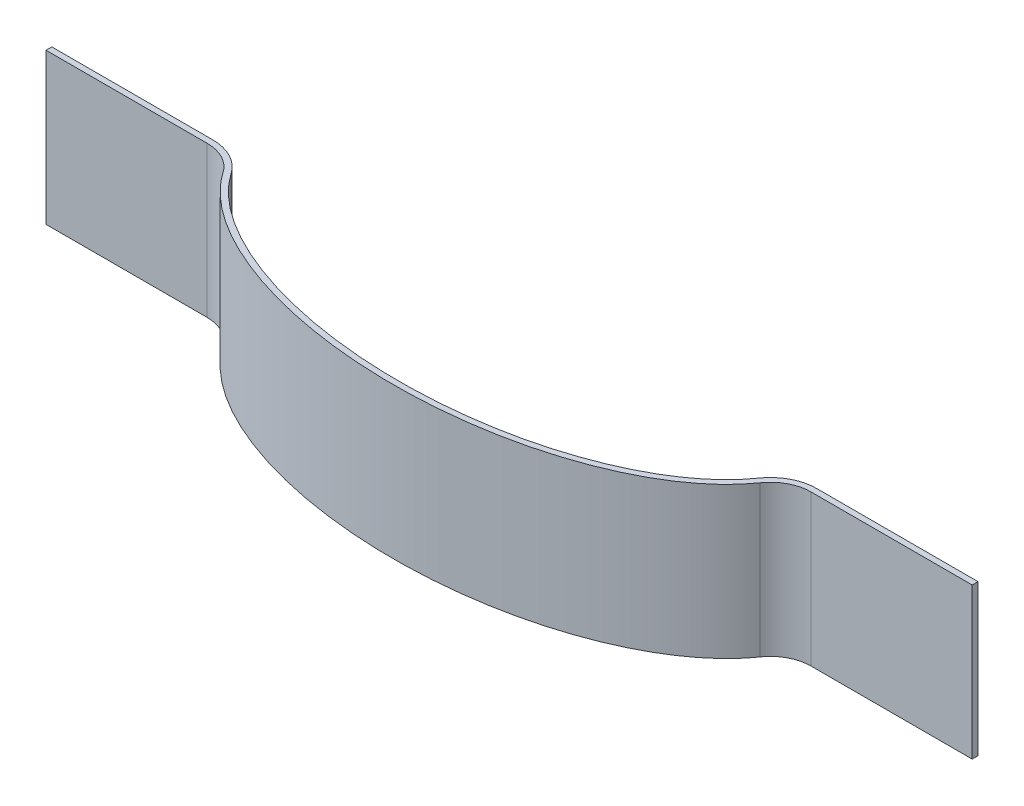
ISO-10303-21;
HEADER;
FILE_DESCRIPTION(('STEP AP214'),'2;1');
FILE_NAME('part.step','',(''),(''),'','','');
FILE_SCHEMA(('AUTOMOTIVE_DESIGN { 1 0 10303 214 1 1 1 1 }'));
ENDSEC;
DATA;
#1=APPLICATION_CONTEXT('core data for automotive mechanical design processes');
#2=APPLICATION_PROTOCOL_DEFINITION('international standard','automotive_design',2000,#1);
#3=PRODUCT_CONTEXT('',#1,'mechanical');
#4=PRODUCT('Part','Part','',(#3));
#5=PRODUCT_RELATED_PRODUCT_CATEGORY('part','',(#4));
#6=PRODUCT_DEFINITION_FORMATION('','',#4);
#7=PRODUCT_DEFINITION_CONTEXT('part definition',#1,'design');
#8=PRODUCT_DEFINITION('design','',#6,#7);
#9=PRODUCT_DEFINITION_SHAPE('','',#8);
#10=(LENGTH_UNIT() NAMED_UNIT(*) SI_UNIT(.MILLI.,.METRE.));
#11=(NAMED_UNIT(*) PLANE_ANGLE_UNIT() SI_UNIT($,.RADIAN.));
#12=(NAMED_UNIT(*) SI_UNIT($,.STERADIAN.) SOLID_ANGLE_UNIT());
#13=UNCERTAINTY_MEASURE_WITH_UNIT(LENGTH_MEASURE(1.E-05),#10,'distance_accuracy_value','');
#14=(GEOMETRIC_REPRESENTATION_CONTEXT(3) GLOBAL_UNCERTAINTY_ASSIGNED_CONTEXT((#13)) GLOBAL_UNIT_ASSIGNED_CONTEXT((#10,
#11,#12)) REPRESENTATION_CONTEXT('',''));
#15=CARTESIAN_POINT('',(0.,0.,0.));
#16=DIRECTION('',(0.,0.,1.));
#17=DIRECTION('',(1.,0.,0.));
#18=AXIS2_PLACEMENT_3D('',#15,#16,#17);
#19=CARTESIAN_POINT('',(82.8323720749977,15.9999999949704,4.99999999502958));
#20=DIRECTION('',(-1.,0.,0.));
#21=DIRECTION('',(0.,0.,1.));
#22=AXIS2_PLACEMENT_3D('',#19,#20,#21);
#23=PLANE('',#22);
#24=DIRECTION('',(0.,-1.,0.));
#25=VECTOR('',#24,1.);
#26=CARTESIAN_POINT('',(82.8323720749977,15.9999999949704,7.49999999502965));
#27=LINE('',#26,#25);
#28=CARTESIAN_POINT('',(82.8323720749977,15.9999999949704,7.49999999502965));
#29=VERTEX_POINT('',#28);
#30=CARTESIAN_POINT('',(82.8323720749977,3.,7.49999999502965));
#31=VERTEX_POINT('',#30);
#32=EDGE_CURVE('E405',#29,#31,#27,.T.);
#33=ORIENTED_EDGE('',*,*,#32,.T.);
#34=DIRECTION('',(0.,0.,-1.));
#35=VECTOR('',#34,1.);
#36=CARTESIAN_POINT('',(82.8323720749977,3.,4.99999999502958));
#37=LINE('',#36,#35);
#38=CARTESIAN_POINT('',(82.8323720749977,3.,6.99999999502962));
#39=VERTEX_POINT('',#38);
#40=EDGE_CURVE('E12',#31,#39,#37,.T.);
#41=ORIENTED_EDGE('',*,*,#40,.T.);
#42=DIRECTION('',(0.,-1.,0.));
#43=VECTOR('',#42,1.);
#44=CARTESIAN_POINT('',(82.8323720749977,15.9999999949704,6.99999999502962));
#45=LINE('',#44,#43);
#46=CARTESIAN_POINT('',(82.8323720749977,15.9999999949704,6.99999999502962));
#47=VERTEX_POINT('',#46);
#48=EDGE_CURVE('E322',#47,#39,#45,.T.);
#49=ORIENTED_EDGE('',*,*,#48,.F.);
#50=DIRECTION('',(0.,0.,-1.));
#51=VECTOR('',#50,1.);
#52=CARTESIAN_POINT('',(82.8323720749977,15.9999999949704,4.99999999502958));
#53=LINE('',#52,#51);
#54=EDGE_CURVE('E139',#29,#47,#53,.T.);
#55=ORIENTED_EDGE('',*,*,#54,.F.);
#56=EDGE_LOOP('',(#33,#41,#49,#55));
#57=FACE_BOUND('',#56,.T.);
#58=ADVANCED_FACE('F128',(#57),#23,.F.);
#59=CARTESIAN_POINT('',(3.,2.99999999999999,4.99999999502958));
#60=DIRECTION('',(1.,0.,0.));
#61=DIRECTION('',(0.,1.,0.));
#62=AXIS2_PLACEMENT_3D('',#59,#60,#61);
#63=PLANE('',#62);
#64=DIRECTION('',(0.,-1.,0.));
#65=VECTOR('',#64,1.);
#66=CARTESIAN_POINT('',(3.,15.9999999949704,7.49999999502963));
#67=LINE('',#66,#65);
#68=CARTESIAN_POINT('',(3.,15.9999999949704,7.49999999502963));
#69=VERTEX_POINT('',#68);
#70=CARTESIAN_POINT('',(3.,2.99999999999999,7.49999999502963));
#71=VERTEX_POINT('',#70);
#72=EDGE_CURVE('E400',#69,#71,#67,.T.);
#73=ORIENTED_EDGE('',*,*,#72,.F.);
#74=DIRECTION('',(0.,0.,-1.));
#75=VECTOR('',#74,1.);
#76=CARTESIAN_POINT('',(3.,15.9999999949704,4.99999999502958));
#77=LINE('',#76,#75);
#78=CARTESIAN_POINT('',(3.,15.9999999949704,6.99999999502963));
#79=VERTEX_POINT('',#78);
#80=EDGE_CURVE('E306',#69,#79,#77,.T.);
#81=ORIENTED_EDGE('',*,*,#80,.T.);
#82=DIRECTION('',(0.,-1.,0.));
#83=VECTOR('',#82,1.);
#84=CARTESIAN_POINT('',(3.,15.9999999949704,6.99999999502963));
#85=LINE('',#84,#83);
#86=CARTESIAN_POINT('',(3.,2.99999999999999,6.99999999502963));
#87=VERTEX_POINT('',#86);
#88=EDGE_CURVE('E327',#79,#87,#85,.T.);
#89=ORIENTED_EDGE('',*,*,#88,.T.);
#90=DIRECTION('',(0.,0.,-1.));
#91=VECTOR('',#90,1.);
#92=CARTESIAN_POINT('',(3.,2.99999999999999,4.99999999502958));
#93=LINE('',#92,#91);
#94=EDGE_CURVE('E304',#71,#87,#93,.T.);
#95=ORIENTED_EDGE('',*,*,#94,.F.);
#96=EDGE_LOOP('',(#73,#81,#89,#95));
#97=FACE_BOUND('',#96,.T.);
#98=ADVANCED_FACE('F263',(#97),#63,.F.);
#99=CARTESIAN_POINT('',(82.8323720749977,3.,4.99999999502958));
#100=DIRECTION('',(0.,1.,0.));
#101=DIRECTION('',(-1.,0.,0.));
#102=AXIS2_PLACEMENT_3D('',#99,#100,#101);
#103=PLANE('',#102);
#104=DIRECTION('',(-1.,0.,0.));
#105=VECTOR('',#104,1.);
#106=CARTESIAN_POINT('',(0.,2.99999999999999,7.49999999502965));
#107=LINE('',#106,#105);
#108=CARTESIAN_POINT('',(16.8897912138371,2.99999999999999,7.49999999502961));
#109=VERTEX_POINT('',#108);
#110=EDGE_CURVE('E412',#109,#71,#107,.T.);
#111=ORIENTED_EDGE('',*,*,#110,.T.);
#112=ORIENTED_EDGE('',*,*,#94,.T.);
#113=DIRECTION('',(-1.,0.,0.));
#114=VECTOR('',#113,1.);
#115=CARTESIAN_POINT('',(0.,2.99999999999999,6.99999999502965));
#116=LINE('',#115,#114);
#117=CARTESIAN_POINT('',(16.8897912138371,2.99999999999999,6.99999999502961));
#118=VERTEX_POINT('',#117);
#119=EDGE_CURVE('E289',#118,#87,#116,.T.);
#120=ORIENTED_EDGE('',*,*,#119,.F.);
#121=CARTESIAN_POINT('',(16.8897912138371,2.99999999999999,10.9999999950296));
#122=DIRECTION('',(0.,-1.,0.));
#123=DIRECTION('',(1.,0.,0.));
#124=AXIS2_PLACEMENT_3D('',#121,#122,#123);
#125=CIRCLE('',#124,4.);
#126=CARTESIAN_POINT('',(20.1851251696277,2.99999999999999,8.7326724669002));
#127=VERTEX_POINT('',#126);
#128=EDGE_CURVE('E287',#118,#127,#125,.T.);
#129=ORIENTED_EDGE('',*,*,#128,.T.);
#130=CARTESIAN_POINT('',(65.6472469103723,3.00000000000001,8.73267246690014));
#131=CARTESIAN_POINT('',(65.2716472671864,3.,9.2785690092468));
#132=CARTESIAN_POINT('',(64.8057405728246,3.,9.82540131314365));
#133=CARTESIAN_POINT('',(63.7000702338113,3.,10.8976990215598));
#134=CARTESIAN_POINT('',(63.0563470004233,3.,11.4256908440767));
#135=CARTESIAN_POINT('',(61.6047402231027,3.,12.43512086693));
#136=CARTESIAN_POINT('',(60.7949531521229,3.,12.9189590451429));
#137=CARTESIAN_POINT('',(59.0285223003519,3.,13.8200073636043));
#138=CARTESIAN_POINT('',(58.0748223346806,3.,14.2370968898553));
#139=CARTESIAN_POINT('',(56.0480335061827,3.,14.9959483978482));
#140=CARTESIAN_POINT('',(54.9749724315891,3.,15.3375848265917));
#141=CARTESIAN_POINT('',(52.7330184987896,3.,15.9320911354275));
#142=CARTESIAN_POINT('',(51.5633350250784,3.,16.1840182789922));
#143=CARTESIAN_POINT('',(47.965036125876,3.,16.790393882437));
#144=CARTESIAN_POINT('',(45.4431287123353,3.,16.9999999950296));
#145=CARTESIAN_POINT('',(40.3892433676648,3.,16.9999999950296));
#146=CARTESIAN_POINT('',(37.8673359541241,3.,16.790393882437));
#147=CARTESIAN_POINT('',(34.2690370549216,3.,16.1840182789922));
#148=CARTESIAN_POINT('',(33.0993535812104,3.,15.9320911354275));
#149=CARTESIAN_POINT('',(30.857399648411,3.,15.3375848265917));
#150=CARTESIAN_POINT('',(29.7843385738173,3.,14.9959483978482));
#151=CARTESIAN_POINT('',(27.7575497453194,3.,14.2370968898553));
#152=CARTESIAN_POINT('',(26.8038497796482,3.,13.8200073636043));
#153=CARTESIAN_POINT('',(25.0374189278772,3.,12.9189590451429));
#154=CARTESIAN_POINT('',(24.2276318568974,3.,12.43512086693));
#155=CARTESIAN_POINT('',(22.7760250795767,3.,11.4256908440767));
#156=CARTESIAN_POINT('',(22.1323018461886,3.,10.8976990215598));
#157=CARTESIAN_POINT('',(21.0266315071755,3.,9.82540131314369));
#158=CARTESIAN_POINT('',(20.5607248128136,3.,9.27856900924684));
#159=CARTESIAN_POINT('',(20.1851251696277,3.,8.73267246690017));
#160=B_SPLINE_CURVE_WITH_KNOTS('',3,(#130,#131,#132,#133,#134,#135,#136,#137,#138,#139,#140,
#141,#142,#143,#144,#145,#146,#147,#148,#149,#150,#151,#152,#153,#154,#155,#156,#157,#158,#159),
.UNSPECIFIED.,.F.,.F.,(4,2,2,2,2,2,2,2,2,2,2,2,2,2,4),(0.,0.0625,0.125,0.1875,0.25,0.3125,0.375,
0.5,0.625,0.687500000000001,0.750000000000001,0.812500000000001,0.875,0.9375,1.),.UNSPECIFIED.);
#161=CARTESIAN_POINT('',(65.6472469103723,3.,8.73267246690017));
#162=VERTEX_POINT('',#161);
#163=EDGE_CURVE('E280',#162,#127,#160,.T.);
#164=ORIENTED_EDGE('',*,*,#163,.F.);
#165=CARTESIAN_POINT('',(68.9425808661629,3.,10.9999999950296));
#166=DIRECTION('',(0.,-1.,0.));
#167=DIRECTION('',(1.,0.,0.));
#168=AXIS2_PLACEMENT_3D('',#165,#166,#167);
#169=CIRCLE('',#168,3.99999999999999);
#170=CARTESIAN_POINT('',(68.9425808661629,3.,6.99999999502959));
#171=VERTEX_POINT('',#170);
#172=EDGE_CURVE('E284',#162,#171,#169,.T.);
#173=ORIENTED_EDGE('',*,*,#172,.T.);
#174=DIRECTION('',(-1.,0.,0.));
#175=VECTOR('',#174,1.);
#176=CARTESIAN_POINT('',(0.,2.99999999999999,6.99999999502933));
#177=LINE('',#176,#175);
#178=EDGE_CURVE('E369',#39,#171,#177,.T.);
#179=ORIENTED_EDGE('',*,*,#178,.F.);
#180=ORIENTED_EDGE('',*,*,#40,.F.);
#181=DIRECTION('',(-1.,0.,0.));
#182=VECTOR('',#181,1.);
#183=CARTESIAN_POINT('',(0.,2.99999999999999,7.49999999502933));
#184=LINE('',#183,#182);
#185=CARTESIAN_POINT('',(68.9425808661629,3.,7.49999999502959));
#186=VERTEX_POINT('',#185);
#187=EDGE_CURVE('E414',#31,#186,#184,.T.);
#188=ORIENTED_EDGE('',*,*,#187,.T.);
#189=CARTESIAN_POINT('',(68.9425808661629,3.,10.9999999950296));
#190=DIRECTION('',(0.,-1.,0.));
#191=DIRECTION('',(1.,0.,0.));
#192=AXIS2_PLACEMENT_3D('',#189,#190,#191);
#193=CIRCLE('',#192,3.49999999999999);
#194=CARTESIAN_POINT('',(66.0591636548461,3.,9.01608840791635));
#195=VERTEX_POINT('',#194);
#196=EDGE_CURVE('E417',#195,#186,#193,.T.);
#197=ORIENTED_EDGE('',*,*,#196,.F.);
#198=CARTESIAN_POINT('',(19.7732084251539,2.99999999999999,9.01608840791635));
#199=CARTESIAN_POINT('',(19.9713938388932,2.99999999999999,9.30413109929432));
#200=CARTESIAN_POINT('',(20.1931598305679,2.99999999999999,9.59210887247306));
#201=CARTESIAN_POINT('',(20.6794623078639,2.99999999999999,10.1606837205478));
#202=CARTESIAN_POINT('',(20.9443706325827,3.,10.4421405057993));
#203=CARTESIAN_POINT('',(21.8053734930658,3.,11.2771555746306));
#204=CARTESIAN_POINT('',(22.4704679530642,3.,11.8222183904558));
#205=CARTESIAN_POINT('',(23.9622706283095,3.,12.8596001608448));
#206=CARTESIAN_POINT('',(24.791639776213,3.,13.3548807820699));
#207=CARTESIAN_POINT('',(26.5952353821716,3.,14.2748866720848));
#208=CARTESIAN_POINT('',(27.5659537801788,3.,14.6992581565983));
#209=CARTESIAN_POINT('',(29.6252949551626,3.,15.4702976127742));
#210=CARTESIAN_POINT('',(30.713882996848,3.,15.8168086431886));
#211=CARTESIAN_POINT('',(32.9865554841931,3.,16.4194606923131));
#212=CARTESIAN_POINT('',(34.1715409443367,3.,16.6746383178585));
#213=CARTESIAN_POINT('',(37.8130667267706,3.,17.2882983988129));
#214=CARTESIAN_POINT('',(40.3614793466387,3.,17.4999999950296));
#215=CARTESIAN_POINT('',(45.4708927333613,3.,17.4999999950296));
#216=CARTESIAN_POINT('',(48.0193053532294,3.,17.2882983988129));
#217=CARTESIAN_POINT('',(51.6608311356633,3.,16.6746383178584));
#218=CARTESIAN_POINT('',(52.845816595807,3.,16.4194606923131));
#219=CARTESIAN_POINT('',(55.1184890831521,3.,15.8168086431886));
#220=CARTESIAN_POINT('',(56.2070771248374,3.,15.4702976127741));
#221=CARTESIAN_POINT('',(58.2664182998213,3.,14.6992581565983));
#222=CARTESIAN_POINT('',(59.2371366978285,3.,14.2748866720848));
#223=CARTESIAN_POINT('',(61.0407323037871,3.,13.3548807820699));
#224=CARTESIAN_POINT('',(61.8701014516906,3.,12.8596001608448));
#225=CARTESIAN_POINT('',(63.3619041269359,3.,11.8222183904558));
#226=CARTESIAN_POINT('',(64.0269985869341,3.,11.2771555746306));
#227=CARTESIAN_POINT('',(64.8880014474173,3.,10.4421405057993));
#228=CARTESIAN_POINT('',(65.1529097721361,3.,10.1606837205477));
#229=CARTESIAN_POINT('',(65.6392122494322,3.,9.592108872473));
#230=CARTESIAN_POINT('',(65.8609782411068,3.,9.30413109929429));
#231=CARTESIAN_POINT('',(66.0591636548461,3.,9.01608840791631));
#232=B_SPLINE_CURVE_WITH_KNOTS('',3,(#198,#199,#200,#201,#202,#203,#204,#205,#206,#207,#208,
#209,#210,#211,#212,#213,#214,#215,#216,#217,#218,#219,#220,#221,#222,#223,#224,#225,#226,#227,
#228,#229,#230,#231),.UNSPECIFIED.,.F.,.F.,(4,2,2,2,2,2,2,2,2,2,2,2,2,2,2,2,4),(0.,0.03125,
0.0625,0.125,0.1875,0.25,0.3125,0.375000000000001,0.500000000000001,0.625000000000001,
0.687500000000001,0.750000000000001,0.8125,0.875,0.9375,0.96875,1.),.UNSPECIFIED.);
#233=CARTESIAN_POINT('',(19.7732084251539,2.99999999999999,9.01608840791637));
#234=VERTEX_POINT('',#233);
#235=EDGE_CURVE('E228',#195,#234,#232,.F.);
#236=ORIENTED_EDGE('',*,*,#235,.T.);
#237=CARTESIAN_POINT('',(16.8897912138371,2.99999999999999,10.9999999950296));
#238=DIRECTION('',(0.,-1.,0.));
#239=DIRECTION('',(1.,0.,0.));
#240=AXIS2_PLACEMENT_3D('',#237,#238,#239);
#241=CIRCLE('',#240,3.5);
#242=EDGE_CURVE('E245',#109,#234,#241,.T.);
#243=ORIENTED_EDGE('',*,*,#242,.F.);
#244=EDGE_LOOP('',(#111,#112,#120,#129,#164,#173,#179,#180,#188,#197,#236,#243));
#245=FACE_BOUND('',#244,.T.);
#246=ADVANCED_FACE('F130',(#245),#103,.F.);
#247=CARTESIAN_POINT('',(3.,15.9999999949704,4.99999999502958));
#248=DIRECTION('',(0.,-1.,0.));
#249=DIRECTION('',(1.,0.,0.));
#250=AXIS2_PLACEMENT_3D('',#247,#248,#249);
#251=PLANE('',#250);
#252=DIRECTION('',(-1.,0.,0.));
#253=VECTOR('',#252,1.);
#254=CARTESIAN_POINT('',(0.,15.9999999949704,7.49999999502965));
#255=LINE('',#254,#253);
#256=CARTESIAN_POINT('',(16.8897912138371,15.9999999949704,7.49999999502961));
#257=VERTEX_POINT('',#256);
#258=EDGE_CURVE('E407',#257,#69,#255,.T.);
#259=ORIENTED_EDGE('',*,*,#258,.F.);
#260=CARTESIAN_POINT('',(16.8897912138371,15.9999999949704,10.9999999950296));
#261=DIRECTION('',(0.,-1.,0.));
#262=DIRECTION('',(1.,0.,0.));
#263=AXIS2_PLACEMENT_3D('',#260,#261,#262);
#264=CIRCLE('',#263,3.5);
#265=CARTESIAN_POINT('',(19.7732084251539,15.9999999949704,9.01608840791637));
#266=VERTEX_POINT('',#265);
#267=EDGE_CURVE('E231',#257,#266,#264,.T.);
#268=ORIENTED_EDGE('',*,*,#267,.T.);
#269=CARTESIAN_POINT('',(66.0591636548461,15.9999999949704,9.01608840791631));
#270=CARTESIAN_POINT('',(65.8609782411068,15.9999999949704,9.30413109929429));
#271=CARTESIAN_POINT('',(65.6392122494322,15.9999999949704,9.592108872473));
#272=CARTESIAN_POINT('',(65.1529097721361,15.9999999949704,10.1606837205477));
#273=CARTESIAN_POINT('',(64.8880014474173,15.9999999949704,10.4421405057993));
#274=CARTESIAN_POINT('',(64.0269985869341,15.9999999949704,11.2771555746306));
#275=CARTESIAN_POINT('',(63.3619041269359,15.9999999949704,11.8222183904558));
#276=CARTESIAN_POINT('',(61.8701014516906,15.9999999949704,12.8596001608448));
#277=CARTESIAN_POINT('',(61.0407323037871,15.9999999949704,13.3548807820699));
#278=CARTESIAN_POINT('',(59.2371366978285,15.9999999949704,14.2748866720848));
#279=CARTESIAN_POINT('',(58.2664182998213,15.9999999949704,14.6992581565983));
#280=CARTESIAN_POINT('',(56.2070771248374,15.9999999949704,15.4702976127741));
#281=CARTESIAN_POINT('',(55.1184890831521,15.9999999949704,15.8168086431886));
#282=CARTESIAN_POINT('',(52.845816595807,15.9999999949704,16.4194606923131));
#283=CARTESIAN_POINT('',(51.6608311356633,15.9999999949704,16.6746383178584));
#284=CARTESIAN_POINT('',(48.0193053532294,15.9999999949704,17.2882983988129));
#285=CARTESIAN_POINT('',(45.4708927333613,15.9999999949704,17.4999999950296));
#286=CARTESIAN_POINT('',(40.3614793466387,15.9999999949704,17.4999999950296));
#287=CARTESIAN_POINT('',(37.8130667267706,15.9999999949704,17.2882983988129));
#288=CARTESIAN_POINT('',(34.1715409443367,15.9999999949704,16.6746383178585));
#289=CARTESIAN_POINT('',(32.9865554841931,15.9999999949704,16.4194606923131));
#290=CARTESIAN_POINT('',(30.713882996848,15.9999999949704,15.8168086431886));
#291=CARTESIAN_POINT('',(29.6252949551626,15.9999999949704,15.4702976127742));
#292=CARTESIAN_POINT('',(27.5659537801788,15.9999999949704,14.6992581565983));
#293=CARTESIAN_POINT('',(26.5952353821716,15.9999999949704,14.2748866720848));
#294=CARTESIAN_POINT('',(24.7916397762129,15.9999999949704,13.3548807820699));
#295=CARTESIAN_POINT('',(23.9622706283095,15.9999999949704,12.8596001608448));
#296=CARTESIAN_POINT('',(22.4704679530641,15.9999999949704,11.8222183904558));
#297=CARTESIAN_POINT('',(21.8053734930658,15.9999999949704,11.2771555746306));
#298=CARTESIAN_POINT('',(20.9443706325827,15.9999999949704,10.4421405057993));
#299=CARTESIAN_POINT('',(20.6794623078639,15.9999999949704,10.1606837205478));
#300=CARTESIAN_POINT('',(20.1931598305679,15.9999999949704,9.59210887247306));
#301=CARTESIAN_POINT('',(19.9713938388932,15.9999999949704,9.30413109929432));
#302=CARTESIAN_POINT('',(19.7732084251539,15.9999999949704,9.01608840791635));
#303=B_SPLINE_CURVE_WITH_KNOTS('',3,(#269,#270,#271,#272,#273,#274,#275,#276,#277,#278,#279,
#280,#281,#282,#283,#284,#285,#286,#287,#288,#289,#290,#291,#292,#293,#294,#295,#296,#297,#298,
#299,#300,#301,#302),.UNSPECIFIED.,.F.,.F.,(4,2,2,2,2,2,2,2,2,2,2,2,2,2,2,2,4),(0.,
0.0312499999999999,0.0624999999999998,0.125,0.1875,0.249999999999999,0.312499999999999,
0.374999999999999,0.499999999999999,0.624999999999999,0.6875,0.75,0.8125,0.875,0.9375,0.96875,
1.),.UNSPECIFIED.);
#304=CARTESIAN_POINT('',(66.0591636548461,15.9999999949704,9.01608840791635));
#305=VERTEX_POINT('',#304);
#306=EDGE_CURVE('E224',#305,#266,#303,.T.);
#307=ORIENTED_EDGE('',*,*,#306,.F.);
#308=CARTESIAN_POINT('',(68.9425808661629,15.9999999949704,10.9999999950296));
#309=DIRECTION('',(0.,-1.,0.));
#310=DIRECTION('',(1.,0.,0.));
#311=AXIS2_PLACEMENT_3D('',#308,#309,#310);
#312=CIRCLE('',#311,3.49999999999999);
#313=CARTESIAN_POINT('',(68.9425808661629,15.9999999949703,7.4999999950296));
#314=VERTEX_POINT('',#313);
#315=EDGE_CURVE('E234',#305,#314,#312,.T.);
#316=ORIENTED_EDGE('',*,*,#315,.T.);
#317=DIRECTION('',(-1.,0.,0.));
#318=VECTOR('',#317,1.);
#319=CARTESIAN_POINT('',(0.,15.9999999949704,7.49999999502933));
#320=LINE('',#319,#318);
#321=EDGE_CURVE('E238',#29,#314,#320,.T.);
#322=ORIENTED_EDGE('',*,*,#321,.F.);
#323=ORIENTED_EDGE('',*,*,#54,.T.);
#324=DIRECTION('',(-1.,0.,0.));
#325=VECTOR('',#324,1.);
#326=CARTESIAN_POINT('',(0.,15.9999999949704,6.99999999502933));
#327=LINE('',#326,#325);
#328=CARTESIAN_POINT('',(68.9425808661629,15.9999999949704,6.99999999502959));
#329=VERTEX_POINT('',#328);
#330=EDGE_CURVE('E313',#47,#329,#327,.T.);
#331=ORIENTED_EDGE('',*,*,#330,.T.);
#332=CARTESIAN_POINT('',(68.9425808661629,15.9999999949704,10.9999999950296));
#333=DIRECTION('',(0.,-1.,0.));
#334=DIRECTION('',(1.,0.,0.));
#335=AXIS2_PLACEMENT_3D('',#332,#333,#334);
#336=CIRCLE('',#335,3.99999999999999);
#337=CARTESIAN_POINT('',(65.6472469103723,15.9999999949704,8.73267246690017));
#338=VERTEX_POINT('',#337);
#339=EDGE_CURVE('E370',#338,#329,#336,.T.);
#340=ORIENTED_EDGE('',*,*,#339,.F.);
#341=CARTESIAN_POINT('',(20.1851251696277,15.9999999949704,8.73267246690017));
#342=CARTESIAN_POINT('',(20.5607248128136,15.9999999949704,9.27856900924684));
#343=CARTESIAN_POINT('',(21.0266315071755,15.9999999949704,9.82540131314369));
#344=CARTESIAN_POINT('',(22.1323018461886,15.9999999949704,10.8976990215598));
#345=CARTESIAN_POINT('',(22.7760250795767,15.9999999949704,11.4256908440767));
#346=CARTESIAN_POINT('',(24.2276318568974,15.9999999949704,12.43512086693));
#347=CARTESIAN_POINT('',(25.0374189278772,15.9999999949704,12.9189590451429));
#348=CARTESIAN_POINT('',(26.8038497796482,15.9999999949704,13.8200073636043));
#349=CARTESIAN_POINT('',(27.7575497453194,15.9999999949704,14.2370968898553));
#350=CARTESIAN_POINT('',(29.7843385738173,15.9999999949704,14.9959483978482));
#351=CARTESIAN_POINT('',(30.857399648411,15.9999999949704,15.3375848265917));
#352=CARTESIAN_POINT('',(33.0993535812104,15.9999999949704,15.9320911354275));
#353=CARTESIAN_POINT('',(34.2690370549216,15.9999999949704,16.1840182789922));
#354=CARTESIAN_POINT('',(37.8673359541241,15.9999999949704,16.790393882437));
#355=CARTESIAN_POINT('',(40.3892433676648,15.9999999949704,16.9999999950296));
#356=CARTESIAN_POINT('',(45.4431287123353,15.9999999949704,16.9999999950296));
#357=CARTESIAN_POINT('',(47.965036125876,15.9999999949704,16.790393882437));
#358=CARTESIAN_POINT('',(51.5633350250784,15.9999999949704,16.1840182789922));
#359=CARTESIAN_POINT('',(52.7330184987896,15.9999999949704,15.9320911354275));
#360=CARTESIAN_POINT('',(54.9749724315891,15.9999999949704,15.3375848265917));
#361=CARTESIAN_POINT('',(56.0480335061827,15.9999999949704,14.9959483978482));
#362=CARTESIAN_POINT('',(58.0748223346806,15.9999999949704,14.2370968898553));
#363=CARTESIAN_POINT('',(59.0285223003519,15.9999999949704,13.8200073636043));
#364=CARTESIAN_POINT('',(60.7949531521229,15.9999999949704,12.9189590451429));
#365=CARTESIAN_POINT('',(61.6047402231027,15.9999999949704,12.43512086693));
#366=CARTESIAN_POINT('',(63.0563470004233,15.9999999949704,11.4256908440767));
#367=CARTESIAN_POINT('',(63.7000702338113,15.9999999949704,10.8976990215598));
#368=CARTESIAN_POINT('',(64.8057405728246,15.9999999949704,9.82540131314365));
#369=CARTESIAN_POINT('',(65.2716472671864,15.9999999949704,9.2785690092468));
#370=CARTESIAN_POINT('',(65.6472469103723,15.9999999949704,8.73267246690014));
#371=B_SPLINE_CURVE_WITH_KNOTS('',3,(#341,#342,#343,#344,#345,#346,#347,#348,#349,#350,#351,
#352,#353,#354,#355,#356,#357,#358,#359,#360,#361,#362,#363,#364,#365,#366,#367,#368,#369,#370),
.UNSPECIFIED.,.F.,.F.,(4,2,2,2,2,2,2,2,2,2,2,2,2,2,4),(0.,0.0624999999999998,0.125,
0.187499999999999,0.249999999999999,0.312499999999999,0.375,0.5,0.625,0.6875,0.75,0.8125,0.875,
0.9375,1.),.UNSPECIFIED.);
#372=CARTESIAN_POINT('',(20.1851251696277,15.9999999949704,8.73267246690017));
#373=VERTEX_POINT('',#372);
#374=EDGE_CURVE('E337',#338,#373,#371,.F.);
#375=ORIENTED_EDGE('',*,*,#374,.T.);
#376=CARTESIAN_POINT('',(16.8897912138371,15.9999999949704,10.9999999950296));
#377=DIRECTION('',(0.,-1.,0.));
#378=DIRECTION('',(1.,0.,0.));
#379=AXIS2_PLACEMENT_3D('',#376,#377,#378);
#380=CIRCLE('',#379,4.);
#381=CARTESIAN_POINT('',(16.8897912138371,15.9999999949704,6.99999999502961));
#382=VERTEX_POINT('',#381);
#383=EDGE_CURVE('E366',#382,#373,#380,.T.);
#384=ORIENTED_EDGE('',*,*,#383,.F.);
#385=DIRECTION('',(-1.,0.,0.));
#386=VECTOR('',#385,1.);
#387=CARTESIAN_POINT('',(0.,15.9999999949704,6.99999999502965));
#388=LINE('',#387,#386);
#389=EDGE_CURVE('E324',#382,#79,#388,.T.);
#390=ORIENTED_EDGE('',*,*,#389,.T.);
#391=ORIENTED_EDGE('',*,*,#80,.F.);
#392=EDGE_LOOP('',(#259,#268,#307,#316,#322,#323,#331,#340,#375,#384,#390,#391));
#393=FACE_BOUND('',#392,.T.);
#394=ADVANCED_FACE('F243',(#393),#251,.F.);
#395=CARTESIAN_POINT('',(68.9425808661629,15.9999999949704,10.9999999950296));
#396=DIRECTION('',(0.,-1.,0.));
#397=DIRECTION('',(1.,0.,0.));
#398=AXIS2_PLACEMENT_3D('',#395,#396,#397);
#399=CYLINDRICAL_SURFACE('',#398,3.99999999999999);
#400=ORIENTED_EDGE('',*,*,#172,.F.);
#401=DIRECTION('',(0.,-1.,0.));
#402=VECTOR('',#401,1.);
#403=CARTESIAN_POINT('',(65.6472469103723,15.9999999949704,8.73267246690017));
#404=LINE('',#403,#402);
#405=EDGE_CURVE('E323',#338,#162,#404,.T.);
#406=ORIENTED_EDGE('',*,*,#405,.F.);
#407=ORIENTED_EDGE('',*,*,#339,.T.);
#408=DIRECTION('',(0.,-1.,0.));
#409=VECTOR('',#408,1.);
#410=CARTESIAN_POINT('',(68.9425808661629,15.9999999949704,6.99999999502959));
#411=LINE('',#410,#409);
#412=EDGE_CURVE('E307',#329,#171,#411,.T.);
#413=ORIENTED_EDGE('',*,*,#412,.T.);
#414=EDGE_LOOP('',(#400,#406,#407,#413));
#415=FACE_BOUND('',#414,.T.);
#416=ADVANCED_FACE('F262',(#415),#399,.T.);
#417=CARTESIAN_POINT('',(0.,15.9999999949704,6.99999999502933));
#418=DIRECTION('',(0.,0.,1.));
#419=DIRECTION('',(1.,0.,0.));
#420=AXIS2_PLACEMENT_3D('',#417,#418,#419);
#421=PLANE('',#420);
#422=ORIENTED_EDGE('',*,*,#178,.T.);
#423=ORIENTED_EDGE('',*,*,#412,.F.);
#424=ORIENTED_EDGE('',*,*,#330,.F.);
#425=ORIENTED_EDGE('',*,*,#48,.T.);
#426=EDGE_LOOP('',(#422,#423,#424,#425));
#427=FACE_BOUND('',#426,.T.);
#428=ADVANCED_FACE('F321',(#427),#421,.F.);
#429=CARTESIAN_POINT('',(0.,15.9999999949704,6.99999999502965));
#430=DIRECTION('',(0.,0.,1.));
#431=DIRECTION('',(1.,0.,0.));
#432=AXIS2_PLACEMENT_3D('',#429,#430,#431);
#433=PLANE('',#432);
#434=ORIENTED_EDGE('',*,*,#119,.T.);
#435=ORIENTED_EDGE('',*,*,#88,.F.);
#436=ORIENTED_EDGE('',*,*,#389,.F.);
#437=DIRECTION('',(0.,-1.,0.));
#438=VECTOR('',#437,1.);
#439=CARTESIAN_POINT('',(16.8897912138371,15.9999999949704,6.99999999502961));
#440=LINE('',#439,#438);
#441=EDGE_CURVE('E331',#382,#118,#440,.T.);
#442=ORIENTED_EDGE('',*,*,#441,.T.);
#443=EDGE_LOOP('',(#434,#435,#436,#442));
#444=FACE_BOUND('',#443,.T.);
#445=ADVANCED_FACE('F388',(#444),#433,.F.);
#446=CARTESIAN_POINT('',(16.8897912138371,15.9999999949704,10.9999999950296));
#447=DIRECTION('',(0.,-1.,0.));
#448=DIRECTION('',(1.,0.,0.));
#449=AXIS2_PLACEMENT_3D('',#446,#447,#448);
#450=CYLINDRICAL_SURFACE('',#449,4.);
#451=ORIENTED_EDGE('',*,*,#128,.F.);
#452=ORIENTED_EDGE('',*,*,#441,.F.);
#453=ORIENTED_EDGE('',*,*,#383,.T.);
#454=DIRECTION('',(0.,-1.,0.));
#455=VECTOR('',#454,1.);
#456=CARTESIAN_POINT('',(20.1851251696277,15.9999999949704,8.7326724669002));
#457=LINE('',#456,#455);
#458=EDGE_CURVE('E155',#373,#127,#457,.T.);
#459=ORIENTED_EDGE('',*,*,#458,.T.);
#460=EDGE_LOOP('',(#451,#452,#453,#459));
#461=FACE_BOUND('',#460,.T.);
#462=ADVANCED_FACE('F352',(#461),#450,.T.);
#463=CARTESIAN_POINT('',(65.6472469103723,15.9999999949704,8.73267246690014));
#464=CARTESIAN_POINT('',(65.2716472671864,15.9999999949704,9.2785690092468));
#465=CARTESIAN_POINT('',(64.8057405728246,15.9999999949704,9.82540131314365));
#466=CARTESIAN_POINT('',(63.7000702338113,15.9999999949704,10.8976990215598));
#467=CARTESIAN_POINT('',(63.0563470004233,15.9999999949704,11.4256908440767));
#468=CARTESIAN_POINT('',(61.6047402231027,15.9999999949704,12.43512086693));
#469=CARTESIAN_POINT('',(60.7949531521229,15.9999999949704,12.9189590451429));
#470=CARTESIAN_POINT('',(59.0285223003519,15.9999999949704,13.8200073636043));
#471=CARTESIAN_POINT('',(58.0748223346806,15.9999999949704,14.2370968898553));
#472=CARTESIAN_POINT('',(56.0480335061827,15.9999999949704,14.9959483978482));
#473=CARTESIAN_POINT('',(54.9749724315891,15.9999999949704,15.3375848265917));
#474=CARTESIAN_POINT('',(52.7330184987896,15.9999999949704,15.9320911354275));
#475=CARTESIAN_POINT('',(51.5633350250784,15.9999999949704,16.1840182789922));
#476=CARTESIAN_POINT('',(47.965036125876,15.9999999949704,16.790393882437));
#477=CARTESIAN_POINT('',(45.4431287123353,15.9999999949704,16.9999999950296));
#478=CARTESIAN_POINT('',(40.3892433676648,15.9999999949704,16.9999999950296));
#479=CARTESIAN_POINT('',(37.8673359541241,15.9999999949704,16.790393882437));
#480=CARTESIAN_POINT('',(34.2690370549216,15.9999999949704,16.1840182789922));
#481=CARTESIAN_POINT('',(33.0993535812104,15.9999999949704,15.9320911354275));
#482=CARTESIAN_POINT('',(30.857399648411,15.9999999949704,15.3375848265917));
#483=CARTESIAN_POINT('',(29.7843385738173,15.9999999949704,14.9959483978482));
#484=CARTESIAN_POINT('',(27.7575497453194,15.9999999949704,14.2370968898553));
#485=CARTESIAN_POINT('',(26.8038497796482,15.9999999949704,13.8200073636043));
#486=CARTESIAN_POINT('',(25.0374189278772,15.9999999949704,12.9189590451429));
#487=CARTESIAN_POINT('',(24.2276318568974,15.9999999949704,12.43512086693));
#488=CARTESIAN_POINT('',(22.7760250795767,15.9999999949704,11.4256908440767));
#489=CARTESIAN_POINT('',(22.1323018461886,15.9999999949704,10.8976990215598));
#490=CARTESIAN_POINT('',(21.0266315071755,15.9999999949704,9.82540131314369));
#491=CARTESIAN_POINT('',(20.5607248128136,15.9999999949704,9.27856900924684));
#492=CARTESIAN_POINT('',(20.1851251696277,15.9999999949704,8.73267246690017));
#493=B_SPLINE_CURVE_WITH_KNOTS('',3,(#463,#464,#465,#466,#467,#468,#469,#470,#471,#472,#473,
#474,#475,#476,#477,#478,#479,#480,#481,#482,#483,#484,#485,#486,#487,#488,#489,#490,#491,#492),
.UNSPECIFIED.,.F.,.F.,(4,2,2,2,2,2,2,2,2,2,2,2,2,2,4),(0.,0.0625,0.125,0.1875,0.25,0.3125,0.375,
0.5,0.625,0.687500000000001,0.750000000000001,0.812500000000001,0.875,0.9375,1.),.UNSPECIFIED.);
#494=DIRECTION('',(0.,-1.,0.));
#495=VECTOR('',#494,1.);
#496=SURFACE_OF_LINEAR_EXTRUSION('',#493,#495);
#497=ORIENTED_EDGE('',*,*,#163,.T.);
#498=ORIENTED_EDGE('',*,*,#458,.F.);
#499=ORIENTED_EDGE('',*,*,#374,.F.);
#500=ORIENTED_EDGE('',*,*,#405,.T.);
#501=EDGE_LOOP('',(#497,#498,#499,#500));
#502=FACE_BOUND('',#501,.T.);
#503=ADVANCED_FACE('F342',(#502),#496,.F.);
#504=CARTESIAN_POINT('',(66.0591636548461,15.9999999949704,9.01608840791631));
#505=CARTESIAN_POINT('',(65.8609782411068,15.9999999949704,9.30413109929429));
#506=CARTESIAN_POINT('',(65.6392122494322,15.9999999949704,9.592108872473));
#507=CARTESIAN_POINT('',(65.1529097721361,15.9999999949704,10.1606837205477));
#508=CARTESIAN_POINT('',(64.8880014474173,15.9999999949704,10.4421405057993));
#509=CARTESIAN_POINT('',(64.0269985869341,15.9999999949704,11.2771555746306));
#510=CARTESIAN_POINT('',(63.3619041269359,15.9999999949704,11.8222183904558));
#511=CARTESIAN_POINT('',(61.8701014516906,15.9999999949704,12.8596001608448));
#512=CARTESIAN_POINT('',(61.0407323037871,15.9999999949704,13.3548807820699));
#513=CARTESIAN_POINT('',(59.2371366978285,15.9999999949704,14.2748866720848));
#514=CARTESIAN_POINT('',(58.2664182998213,15.9999999949704,14.6992581565983));
#515=CARTESIAN_POINT('',(56.2070771248374,15.9999999949704,15.4702976127741));
#516=CARTESIAN_POINT('',(55.1184890831521,15.9999999949704,15.8168086431886));
#517=CARTESIAN_POINT('',(52.845816595807,15.9999999949704,16.4194606923131));
#518=CARTESIAN_POINT('',(51.6608311356633,15.9999999949704,16.6746383178584));
#519=CARTESIAN_POINT('',(48.0193053532294,15.9999999949704,17.2882983988129));
#520=CARTESIAN_POINT('',(45.4708927333613,15.9999999949704,17.4999999950296));
#521=CARTESIAN_POINT('',(40.3614793466387,15.9999999949704,17.4999999950296));
#522=CARTESIAN_POINT('',(37.8130667267706,15.9999999949704,17.2882983988129));
#523=CARTESIAN_POINT('',(34.1715409443367,15.9999999949704,16.6746383178585));
#524=CARTESIAN_POINT('',(32.9865554841931,15.9999999949704,16.4194606923131));
#525=CARTESIAN_POINT('',(30.713882996848,15.9999999949704,15.8168086431886));
#526=CARTESIAN_POINT('',(29.6252949551626,15.9999999949704,15.4702976127742));
#527=CARTESIAN_POINT('',(27.5659537801788,15.9999999949704,14.6992581565983));
#528=CARTESIAN_POINT('',(26.5952353821716,15.9999999949704,14.2748866720848));
#529=CARTESIAN_POINT('',(24.7916397762129,15.9999999949704,13.3548807820699));
#530=CARTESIAN_POINT('',(23.9622706283095,15.9999999949704,12.8596001608448));
#531=CARTESIAN_POINT('',(22.4704679530641,15.9999999949704,11.8222183904558));
#532=CARTESIAN_POINT('',(21.8053734930658,15.9999999949704,11.2771555746306));
#533=CARTESIAN_POINT('',(20.9443706325827,15.9999999949704,10.4421405057993));
#534=CARTESIAN_POINT('',(20.6794623078639,15.9999999949704,10.1606837205478));
#535=CARTESIAN_POINT('',(20.1931598305679,15.9999999949704,9.59210887247306));
#536=CARTESIAN_POINT('',(19.9713938388932,15.9999999949704,9.30413109929432));
#537=CARTESIAN_POINT('',(19.7732084251539,15.9999999949704,9.01608840791635));
#538=B_SPLINE_CURVE_WITH_KNOTS('',3,(#504,#505,#506,#507,#508,#509,#510,#511,#512,#513,#514,
#515,#516,#517,#518,#519,#520,#521,#522,#523,#524,#525,#526,#527,#528,#529,#530,#531,#532,#533,
#534,#535,#536,#537),.UNSPECIFIED.,.F.,.F.,(4,2,2,2,2,2,2,2,2,2,2,2,2,2,2,2,4),(0.,
0.0312499999999999,0.0624999999999998,0.125,0.1875,0.249999999999999,0.312499999999999,
0.374999999999999,0.499999999999999,0.624999999999999,0.6875,0.75,0.8125,0.875,0.9375,0.96875,
1.),.UNSPECIFIED.);
#539=DIRECTION('',(0.,-1.,0.));
#540=VECTOR('',#539,1.);
#541=SURFACE_OF_LINEAR_EXTRUSION('',#538,#540);
#542=ORIENTED_EDGE('',*,*,#235,.F.);
#543=DIRECTION('',(0.,-1.,0.));
#544=VECTOR('',#543,1.);
#545=CARTESIAN_POINT('',(66.0591636548461,15.9999999949704,9.01608840791635));
#546=LINE('',#545,#544);
#547=EDGE_CURVE('E221',#305,#195,#546,.T.);
#548=ORIENTED_EDGE('',*,*,#547,.F.);
#549=ORIENTED_EDGE('',*,*,#306,.T.);
#550=DIRECTION('',(0.,-1.,0.));
#551=VECTOR('',#550,1.);
#552=CARTESIAN_POINT('',(19.7732084251539,15.9999999949704,9.01608840791637));
#553=LINE('',#552,#551);
#554=EDGE_CURVE('E291',#266,#234,#553,.T.);
#555=ORIENTED_EDGE('',*,*,#554,.T.);
#556=EDGE_LOOP('',(#542,#548,#549,#555));
#557=FACE_BOUND('',#556,.T.);
#558=ADVANCED_FACE('F222',(#557),#541,.T.);
#559=CARTESIAN_POINT('',(16.8897912138371,15.9999999949704,10.9999999950296));
#560=DIRECTION('',(0.,-1.,0.));
#561=DIRECTION('',(1.,0.,0.));
#562=AXIS2_PLACEMENT_3D('',#559,#560,#561);
#563=CYLINDRICAL_SURFACE('',#562,3.5);
#564=ORIENTED_EDGE('',*,*,#242,.T.);
#565=ORIENTED_EDGE('',*,*,#554,.F.);
#566=ORIENTED_EDGE('',*,*,#267,.F.);
#567=DIRECTION('',(0.,-1.,0.));
#568=VECTOR('',#567,1.);
#569=CARTESIAN_POINT('',(16.8897912138371,15.9999999949704,7.49999999502961));
#570=LINE('',#569,#568);
#571=EDGE_CURVE('E293',#257,#109,#570,.T.);
#572=ORIENTED_EDGE('',*,*,#571,.T.);
#573=EDGE_LOOP('',(#564,#565,#566,#572));
#574=FACE_BOUND('',#573,.T.);
#575=ADVANCED_FACE('F437',(#574),#563,.F.);
#576=CARTESIAN_POINT('',(0.,15.9999999949704,7.49999999502965));
#577=DIRECTION('',(0.,0.,1.));
#578=DIRECTION('',(1.,0.,0.));
#579=AXIS2_PLACEMENT_3D('',#576,#577,#578);
#580=PLANE('',#579);
#581=ORIENTED_EDGE('',*,*,#110,.F.);
#582=ORIENTED_EDGE('',*,*,#571,.F.);
#583=ORIENTED_EDGE('',*,*,#258,.T.);
#584=ORIENTED_EDGE('',*,*,#72,.T.);
#585=EDGE_LOOP('',(#581,#582,#583,#584));
#586=FACE_BOUND('',#585,.T.);
#587=ADVANCED_FACE('F466',(#586),#580,.T.);
#588=CARTESIAN_POINT('',(0.,15.9999999949704,7.49999999502933));
#589=DIRECTION('',(0.,0.,1.));
#590=DIRECTION('',(1.,0.,0.));
#591=AXIS2_PLACEMENT_3D('',#588,#589,#590);
#592=PLANE('',#591);
#593=ORIENTED_EDGE('',*,*,#187,.F.);
#594=ORIENTED_EDGE('',*,*,#32,.F.);
#595=ORIENTED_EDGE('',*,*,#321,.T.);
#596=DIRECTION('',(0.,-1.,0.));
#597=VECTOR('',#596,1.);
#598=CARTESIAN_POINT('',(68.9425808661629,15.9999999949704,7.49999999502959));
#599=LINE('',#598,#597);
#600=EDGE_CURVE('E147',#314,#186,#599,.T.);
#601=ORIENTED_EDGE('',*,*,#600,.T.);
#602=EDGE_LOOP('',(#593,#594,#595,#601));
#603=FACE_BOUND('',#602,.T.);
#604=ADVANCED_FACE('F464',(#603),#592,.T.);
#605=CARTESIAN_POINT('',(68.9425808661629,15.9999999949704,10.9999999950296));
#606=DIRECTION('',(0.,-1.,0.));
#607=DIRECTION('',(1.,0.,0.));
#608=AXIS2_PLACEMENT_3D('',#605,#606,#607);
#609=CYLINDRICAL_SURFACE('',#608,3.49999999999999);
#610=ORIENTED_EDGE('',*,*,#196,.T.);
#611=ORIENTED_EDGE('',*,*,#600,.F.);
#612=ORIENTED_EDGE('',*,*,#315,.F.);
#613=ORIENTED_EDGE('',*,*,#547,.T.);
#614=EDGE_LOOP('',(#610,#611,#612,#613));
#615=FACE_BOUND('',#614,.T.);
#616=ADVANCED_FACE('F235',(#615),#609,.F.);
#617=CLOSED_SHELL('',(#58,#98,#246,#394,#416,#428,#445,#462,#503,#558,#575,#587,#604,#616));
#618=MANIFOLD_SOLID_BREP('B2',#617);
#619=ADVANCED_BREP_SHAPE_REPRESENTATION('',(#18,#618),#14);
#620=SHAPE_DEFINITION_REPRESENTATION(#9,#619);
ENDSEC;
END-ISO-10303-21;
